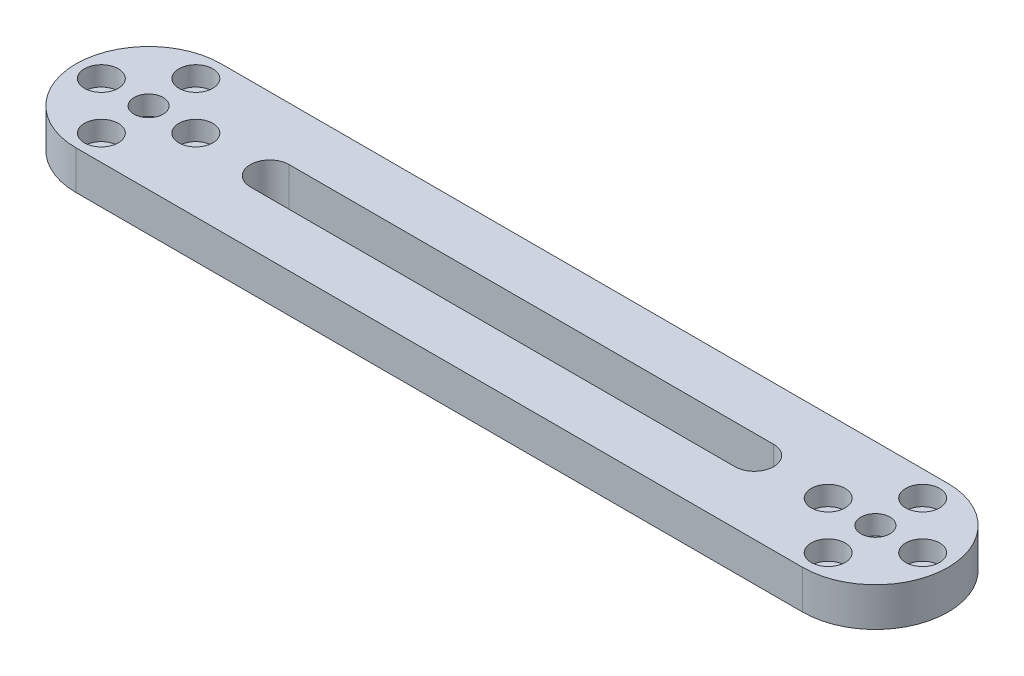
ISO-10303-21;
HEADER;
FILE_DESCRIPTION(('STEP AP214'),'2;1');
FILE_NAME('part.step','',(''),(''),'','','');
FILE_SCHEMA(('AUTOMOTIVE_DESIGN { 1 0 10303 214 1 1 1 1 }'));
ENDSEC;
DATA;
#1=APPLICATION_CONTEXT('core data for automotive mechanical design processes');
#2=APPLICATION_PROTOCOL_DEFINITION('international standard','automotive_design',2000,#1);
#3=PRODUCT_CONTEXT('',#1,'mechanical');
#4=PRODUCT('Part','Part','',(#3));
#5=PRODUCT_RELATED_PRODUCT_CATEGORY('part','',(#4));
#6=PRODUCT_DEFINITION_FORMATION('','',#4);
#7=PRODUCT_DEFINITION_CONTEXT('part definition',#1,'design');
#8=PRODUCT_DEFINITION('design','',#6,#7);
#9=PRODUCT_DEFINITION_SHAPE('','',#8);
#10=(LENGTH_UNIT() NAMED_UNIT(*) SI_UNIT(.MILLI.,.METRE.));
#11=(NAMED_UNIT(*) PLANE_ANGLE_UNIT() SI_UNIT($,.RADIAN.));
#12=(NAMED_UNIT(*) SI_UNIT($,.STERADIAN.) SOLID_ANGLE_UNIT());
#13=UNCERTAINTY_MEASURE_WITH_UNIT(LENGTH_MEASURE(1.E-05),#10,'distance_accuracy_value','');
#14=(GEOMETRIC_REPRESENTATION_CONTEXT(3) GLOBAL_UNCERTAINTY_ASSIGNED_CONTEXT((#13)) GLOBAL_UNIT_ASSIGNED_CONTEXT((#10,
#11,#12)) REPRESENTATION_CONTEXT('',''));
#15=CARTESIAN_POINT('',(0.,0.,0.));
#16=DIRECTION('',(0.,0.,1.));
#17=DIRECTION('',(1.,0.,0.));
#18=AXIS2_PLACEMENT_3D('',#15,#16,#17);
#19=CARTESIAN_POINT('',(0.,8.,0.));
#20=DIRECTION('',(0.,-1.,0.));
#21=DIRECTION('',(0.,0.,-1.));
#22=AXIS2_PLACEMENT_3D('',#19,#20,#21);
#23=CYLINDRICAL_SURFACE('',#22,1.6);
#24=CARTESIAN_POINT('',(0.,0.,0.));
#25=DIRECTION('',(0.,1.,0.));
#26=DIRECTION('',(0.,0.,1.));
#27=AXIS2_PLACEMENT_3D('',#24,#25,#26);
#28=CIRCLE('',#27,1.6);
#29=CARTESIAN_POINT('',(0.,0.,1.6));
#30=VERTEX_POINT('',#29);
#31=EDGE_CURVE('E229',#30,#30,#28,.T.);
#32=ORIENTED_EDGE('',*,*,#31,.F.);
#33=EDGE_LOOP('',(#32));
#34=FACE_BOUND('',#33,.T.);
#35=CARTESIAN_POINT('',(0.,4.,0.));
#36=DIRECTION('',(0.,1.,0.));
#37=DIRECTION('',(0.,0.,1.));
#38=AXIS2_PLACEMENT_3D('',#35,#36,#37);
#39=CIRCLE('',#38,1.6);
#40=CARTESIAN_POINT('',(0.,4.,1.6));
#41=VERTEX_POINT('',#40);
#42=EDGE_CURVE('E281',#41,#41,#39,.T.);
#43=ORIENTED_EDGE('',*,*,#42,.T.);
#44=EDGE_LOOP('',(#43));
#45=FACE_BOUND('',#44,.T.);
#46=ADVANCED_FACE('F41',(#34,#45),#23,.F.);
#47=CARTESIAN_POINT('',(9.71048556079929,8.,0.));
#48=DIRECTION('',(0.,-1.,0.));
#49=DIRECTION('',(0.,0.,-1.));
#50=AXIS2_PLACEMENT_3D('',#47,#48,#49);
#51=CYLINDRICAL_SURFACE('',#50,1.6);
#52=CARTESIAN_POINT('',(9.71048556079929,0.,0.));
#53=DIRECTION('',(0.,1.,0.));
#54=DIRECTION('',(0.,0.,1.));
#55=AXIS2_PLACEMENT_3D('',#52,#53,#54);
#56=CIRCLE('',#55,1.6);
#57=CARTESIAN_POINT('',(9.71048556079929,0.,1.6));
#58=VERTEX_POINT('',#57);
#59=EDGE_CURVE('E223',#58,#58,#56,.T.);
#60=ORIENTED_EDGE('',*,*,#59,.F.);
#61=EDGE_LOOP('',(#60));
#62=FACE_BOUND('',#61,.T.);
#63=CARTESIAN_POINT('',(9.71048556079929,4.,0.));
#64=DIRECTION('',(0.,1.,0.));
#65=DIRECTION('',(0.,0.,1.));
#66=AXIS2_PLACEMENT_3D('',#63,#64,#65);
#67=CIRCLE('',#66,1.6);
#68=CARTESIAN_POINT('',(9.71048556079929,4.,1.6));
#69=VERTEX_POINT('',#68);
#70=EDGE_CURVE('E275',#69,#69,#67,.T.);
#71=ORIENTED_EDGE('',*,*,#70,.T.);
#72=EDGE_LOOP('',(#71));
#73=FACE_BOUND('',#72,.T.);
#74=ADVANCED_FACE('F309',(#62,#73),#51,.F.);
#75=CARTESIAN_POINT('',(-9.75,8.,0.));
#76=DIRECTION('',(0.,-1.,0.));
#77=DIRECTION('',(0.,0.,-1.));
#78=AXIS2_PLACEMENT_3D('',#75,#76,#77);
#79=CYLINDRICAL_SURFACE('',#78,1.6);
#80=CARTESIAN_POINT('',(-9.75,0.,0.));
#81=DIRECTION('',(0.,1.,0.));
#82=DIRECTION('',(0.,0.,1.));
#83=AXIS2_PLACEMENT_3D('',#80,#81,#82);
#84=CIRCLE('',#83,1.6);
#85=CARTESIAN_POINT('',(-9.75,0.,1.6));
#86=VERTEX_POINT('',#85);
#87=EDGE_CURVE('E220',#86,#86,#84,.T.);
#88=ORIENTED_EDGE('',*,*,#87,.F.);
#89=EDGE_LOOP('',(#88));
#90=FACE_BOUND('',#89,.T.);
#91=CARTESIAN_POINT('',(-9.75,4.,0.));
#92=DIRECTION('',(0.,1.,0.));
#93=DIRECTION('',(0.,0.,1.));
#94=AXIS2_PLACEMENT_3D('',#91,#92,#93);
#95=CIRCLE('',#94,1.6);
#96=CARTESIAN_POINT('',(-9.75,4.,1.6));
#97=VERTEX_POINT('',#96);
#98=EDGE_CURVE('E272',#97,#97,#95,.T.);
#99=ORIENTED_EDGE('',*,*,#98,.T.);
#100=EDGE_LOOP('',(#99));
#101=FACE_BOUND('',#100,.T.);
#102=ADVANCED_FACE('F315',(#90,#101),#79,.F.);
#103=CARTESIAN_POINT('',(0.,8.,9.75));
#104=DIRECTION('',(0.,-1.,0.));
#105=DIRECTION('',(0.,0.,-1.));
#106=AXIS2_PLACEMENT_3D('',#103,#104,#105);
#107=CYLINDRICAL_SURFACE('',#106,2.1);
#108=CARTESIAN_POINT('',(0.,0.,9.75));
#109=DIRECTION('',(0.,1.,0.));
#110=DIRECTION('',(0.,0.,1.));
#111=AXIS2_PLACEMENT_3D('',#108,#109,#110);
#112=CIRCLE('',#111,2.1);
#113=CARTESIAN_POINT('',(0.,0.,11.85));
#114=VERTEX_POINT('',#113);
#115=EDGE_CURVE('E217',#114,#114,#112,.T.);
#116=ORIENTED_EDGE('',*,*,#115,.F.);
#117=EDGE_LOOP('',(#116));
#118=FACE_BOUND('',#117,.T.);
#119=CARTESIAN_POINT('',(0.,4.,9.75));
#120=DIRECTION('',(0.,1.,0.));
#121=DIRECTION('',(0.,0.,1.));
#122=AXIS2_PLACEMENT_3D('',#119,#120,#121);
#123=CIRCLE('',#122,2.1);
#124=CARTESIAN_POINT('',(0.,4.,11.85));
#125=VERTEX_POINT('',#124);
#126=EDGE_CURVE('E269',#125,#125,#123,.T.);
#127=ORIENTED_EDGE('',*,*,#126,.T.);
#128=EDGE_LOOP('',(#127));
#129=FACE_BOUND('',#128,.T.);
#130=ADVANCED_FACE('F332',(#118,#129),#107,.F.);
#131=CARTESIAN_POINT('',(0.,8.,-9.75));
#132=DIRECTION('',(0.,-1.,0.));
#133=DIRECTION('',(0.,0.,-1.));
#134=AXIS2_PLACEMENT_3D('',#131,#132,#133);
#135=CYLINDRICAL_SURFACE('',#134,2.1);
#136=CARTESIAN_POINT('',(0.,0.,-9.75));
#137=DIRECTION('',(0.,1.,0.));
#138=DIRECTION('',(0.,0.,1.));
#139=AXIS2_PLACEMENT_3D('',#136,#137,#138);
#140=CIRCLE('',#139,2.1);
#141=CARTESIAN_POINT('',(0.,0.,-7.65));
#142=VERTEX_POINT('',#141);
#143=EDGE_CURVE('E214',#142,#142,#140,.T.);
#144=ORIENTED_EDGE('',*,*,#143,.F.);
#145=EDGE_LOOP('',(#144));
#146=FACE_BOUND('',#145,.T.);
#147=CARTESIAN_POINT('',(0.,4.,-9.75));
#148=DIRECTION('',(0.,1.,0.));
#149=DIRECTION('',(0.,0.,1.));
#150=AXIS2_PLACEMENT_3D('',#147,#148,#149);
#151=CIRCLE('',#150,2.1);
#152=CARTESIAN_POINT('',(0.,4.,-7.65));
#153=VERTEX_POINT('',#152);
#154=EDGE_CURVE('E266',#153,#153,#151,.T.);
#155=ORIENTED_EDGE('',*,*,#154,.T.);
#156=EDGE_LOOP('',(#155));
#157=FACE_BOUND('',#156,.T.);
#158=ADVANCED_FACE('F336',(#146,#157),#135,.F.);
#159=CARTESIAN_POINT('',(0.,8.,15.));
#160=DIRECTION('',(0.,0.,-1.));
#161=DIRECTION('',(-1.,0.,0.));
#162=AXIS2_PLACEMENT_3D('',#159,#160,#161);
#163=PLANE('',#162);
#164=DIRECTION('',(1.,0.,0.));
#165=VECTOR('',#164,1.);
#166=CARTESIAN_POINT('',(0.,0.,15.));
#167=LINE('',#166,#165);
#168=CARTESIAN_POINT('',(0.,0.,15.));
#169=VERTEX_POINT('',#168);
#170=CARTESIAN_POINT('',(150.,0.,15.));
#171=VERTEX_POINT('',#170);
#172=EDGE_CURVE('E232',#169,#171,#167,.T.);
#173=ORIENTED_EDGE('',*,*,#172,.T.);
#174=DIRECTION('',(0.,-1.,0.));
#175=VECTOR('',#174,1.);
#176=CARTESIAN_POINT('',(150.,8.,15.));
#177=LINE('',#176,#175);
#178=CARTESIAN_POINT('',(150.,8.,15.));
#179=VERTEX_POINT('',#178);
#180=EDGE_CURVE('E254',#179,#171,#177,.T.);
#181=ORIENTED_EDGE('',*,*,#180,.F.);
#182=DIRECTION('',(1.,0.,0.));
#183=VECTOR('',#182,1.);
#184=CARTESIAN_POINT('',(0.,8.,15.));
#185=LINE('',#184,#183);
#186=CARTESIAN_POINT('',(0.,8.,15.));
#187=VERTEX_POINT('',#186);
#188=EDGE_CURVE('E195',#187,#179,#185,.T.);
#189=ORIENTED_EDGE('',*,*,#188,.F.);
#190=DIRECTION('',(0.,-1.,0.));
#191=VECTOR('',#190,1.);
#192=CARTESIAN_POINT('',(0.,8.,15.));
#193=LINE('',#192,#191);
#194=EDGE_CURVE('E206',#187,#169,#193,.T.);
#195=ORIENTED_EDGE('',*,*,#194,.T.);
#196=EDGE_LOOP('',(#173,#181,#189,#195));
#197=FACE_BOUND('',#196,.T.);
#198=ADVANCED_FACE('F322',(#197),#163,.F.);
#199=CARTESIAN_POINT('',(150.,8.,0.));
#200=DIRECTION('',(0.,-1.,0.));
#201=DIRECTION('',(0.,0.,-1.));
#202=AXIS2_PLACEMENT_3D('',#199,#200,#201);
#203=CYLINDRICAL_SURFACE('',#202,15.);
#204=CARTESIAN_POINT('',(150.,0.,0.));
#205=DIRECTION('',(0.,1.,0.));
#206=DIRECTION('',(0.,0.,1.));
#207=AXIS2_PLACEMENT_3D('',#204,#205,#206);
#208=CIRCLE('',#207,15.);
#209=CARTESIAN_POINT('',(150.,0.,-15.));
#210=VERTEX_POINT('',#209);
#211=EDGE_CURVE('E235',#171,#210,#208,.T.);
#212=ORIENTED_EDGE('',*,*,#211,.T.);
#213=DIRECTION('',(0.,-1.,0.));
#214=VECTOR('',#213,1.);
#215=CARTESIAN_POINT('',(150.,8.,-15.));
#216=LINE('',#215,#214);
#217=CARTESIAN_POINT('',(150.,8.,-15.));
#218=VERTEX_POINT('',#217);
#219=EDGE_CURVE('E252',#218,#210,#216,.T.);
#220=ORIENTED_EDGE('',*,*,#219,.F.);
#221=CARTESIAN_POINT('',(150.,8.,0.));
#222=DIRECTION('',(0.,1.,0.));
#223=DIRECTION('',(0.,0.,1.));
#224=AXIS2_PLACEMENT_3D('',#221,#222,#223);
#225=CIRCLE('',#224,15.);
#226=EDGE_CURVE('E198',#179,#218,#225,.T.);
#227=ORIENTED_EDGE('',*,*,#226,.F.);
#228=ORIENTED_EDGE('',*,*,#180,.T.);
#229=EDGE_LOOP('',(#212,#220,#227,#228));
#230=FACE_BOUND('',#229,.T.);
#231=ADVANCED_FACE('F390',(#230),#203,.T.);
#232=CARTESIAN_POINT('',(0.,8.,-15.));
#233=DIRECTION('',(0.,0.,-1.));
#234=DIRECTION('',(-1.,0.,0.));
#235=AXIS2_PLACEMENT_3D('',#232,#233,#234);
#236=PLANE('',#235);
#237=DIRECTION('',(1.,0.,0.));
#238=VECTOR('',#237,1.);
#239=CARTESIAN_POINT('',(0.,0.,-15.));
#240=LINE('',#239,#238);
#241=CARTESIAN_POINT('',(0.,0.,-15.));
#242=VERTEX_POINT('',#241);
#243=EDGE_CURVE('E238',#242,#210,#240,.T.);
#244=ORIENTED_EDGE('',*,*,#243,.F.);
#245=DIRECTION('',(0.,-1.,0.));
#246=VECTOR('',#245,1.);
#247=CARTESIAN_POINT('',(0.,8.,-15.));
#248=LINE('',#247,#246);
#249=CARTESIAN_POINT('',(0.,8.,-15.));
#250=VERTEX_POINT('',#249);
#251=EDGE_CURVE('E250',#250,#242,#248,.T.);
#252=ORIENTED_EDGE('',*,*,#251,.F.);
#253=DIRECTION('',(1.,0.,0.));
#254=VECTOR('',#253,1.);
#255=CARTESIAN_POINT('',(0.,8.,-15.));
#256=LINE('',#255,#254);
#257=EDGE_CURVE('E201',#250,#218,#256,.T.);
#258=ORIENTED_EDGE('',*,*,#257,.T.);
#259=ORIENTED_EDGE('',*,*,#219,.T.);
#260=EDGE_LOOP('',(#244,#252,#258,#259));
#261=FACE_BOUND('',#260,.T.);
#262=ADVANCED_FACE('F384',(#261),#236,.T.);
#263=CARTESIAN_POINT('',(159.75,8.,0.));
#264=DIRECTION('',(0.,-1.,0.));
#265=DIRECTION('',(0.,0.,-1.));
#266=AXIS2_PLACEMENT_3D('',#263,#264,#265);
#267=CYLINDRICAL_SURFACE('',#266,1.60000000000002);
#268=CARTESIAN_POINT('',(159.75,4.,0.));
#269=DIRECTION('',(0.,-1.,0.));
#270=DIRECTION('',(0.,0.,-1.));
#271=AXIS2_PLACEMENT_3D('',#268,#269,#270);
#272=CIRCLE('',#271,1.60000000000002);
#273=CARTESIAN_POINT('',(159.75,4.,-1.60000000000002));
#274=VERTEX_POINT('',#273);
#275=EDGE_CURVE('E211',#274,#274,#272,.F.);
#276=ORIENTED_EDGE('',*,*,#275,.T.);
#277=EDGE_LOOP('',(#276));
#278=FACE_BOUND('',#277,.T.);
#279=CARTESIAN_POINT('',(159.75,0.,0.));
#280=DIRECTION('',(0.,1.,0.));
#281=DIRECTION('',(0.,0.,1.));
#282=AXIS2_PLACEMENT_3D('',#279,#280,#281);
#283=CIRCLE('',#282,1.60000000000002);
#284=CARTESIAN_POINT('',(159.75,0.,1.60000000000002));
#285=VERTEX_POINT('',#284);
#286=EDGE_CURVE('E243',#285,#285,#283,.F.);
#287=ORIENTED_EDGE('',*,*,#286,.T.);
#288=EDGE_LOOP('',(#287));
#289=FACE_BOUND('',#288,.T.);
#290=ADVANCED_FACE('F381',(#278,#289),#267,.F.);
#291=CARTESIAN_POINT('',(0.,8.,0.));
#292=DIRECTION('',(0.,-1.,0.));
#293=DIRECTION('',(0.,0.,-1.));
#294=AXIS2_PLACEMENT_3D('',#291,#292,#293);
#295=CYLINDRICAL_SURFACE('',#294,15.);
#296=CARTESIAN_POINT('',(0.,0.,0.));
#297=DIRECTION('',(0.,1.,0.));
#298=DIRECTION('',(0.,0.,1.));
#299=AXIS2_PLACEMENT_3D('',#296,#297,#298);
#300=CIRCLE('',#299,15.);
#301=EDGE_CURVE('E241',#242,#169,#300,.T.);
#302=ORIENTED_EDGE('',*,*,#301,.T.);
#303=ORIENTED_EDGE('',*,*,#194,.F.);
#304=CARTESIAN_POINT('',(0.,8.,0.));
#305=DIRECTION('',(0.,1.,0.));
#306=DIRECTION('',(0.,0.,1.));
#307=AXIS2_PLACEMENT_3D('',#304,#305,#306);
#308=CIRCLE('',#307,15.);
#309=EDGE_CURVE('E204',#250,#187,#308,.T.);
#310=ORIENTED_EDGE('',*,*,#309,.F.);
#311=ORIENTED_EDGE('',*,*,#251,.T.);
#312=EDGE_LOOP('',(#302,#303,#310,#311));
#313=FACE_BOUND('',#312,.T.);
#314=ADVANCED_FACE('F327',(#313),#295,.T.);
#315=CARTESIAN_POINT('',(150.,8.,0.));
#316=DIRECTION('',(0.,-1.,0.));
#317=DIRECTION('',(0.,0.,-1.));
#318=AXIS2_PLACEMENT_3D('',#315,#316,#317);
#319=CYLINDRICAL_SURFACE('',#318,1.60000000000002);
#320=CARTESIAN_POINT('',(150.,4.,0.));
#321=DIRECTION('',(0.,-1.,0.));
#322=DIRECTION('',(0.,0.,-1.));
#323=AXIS2_PLACEMENT_3D('',#320,#321,#322);
#324=CIRCLE('',#323,1.60000000000002);
#325=CARTESIAN_POINT('',(150.,4.,-1.60000000000002));
#326=VERTEX_POINT('',#325);
#327=EDGE_CURVE('E278',#326,#326,#324,.T.);
#328=ORIENTED_EDGE('',*,*,#327,.F.);
#329=EDGE_LOOP('',(#328));
#330=FACE_BOUND('',#329,.T.);
#331=CARTESIAN_POINT('',(150.,0.,0.));
#332=DIRECTION('',(0.,1.,0.));
#333=DIRECTION('',(0.,0.,1.));
#334=AXIS2_PLACEMENT_3D('',#331,#332,#333);
#335=CIRCLE('',#334,1.60000000000002);
#336=CARTESIAN_POINT('',(150.,0.,1.60000000000002));
#337=VERTEX_POINT('',#336);
#338=EDGE_CURVE('E226',#337,#337,#335,.T.);
#339=ORIENTED_EDGE('',*,*,#338,.F.);
#340=EDGE_LOOP('',(#339));
#341=FACE_BOUND('',#340,.T.);
#342=ADVANCED_FACE('F324',(#330,#341),#319,.F.);
#343=CARTESIAN_POINT('',(150.,8.,-9.75));
#344=DIRECTION('',(0.,-1.,0.));
#345=DIRECTION('',(0.,0.,-1.));
#346=AXIS2_PLACEMENT_3D('',#343,#344,#345);
#347=CYLINDRICAL_SURFACE('',#346,2.09999999999999);
#348=CARTESIAN_POINT('',(150.,4.,-9.75));
#349=DIRECTION('',(0.,-1.,0.));
#350=DIRECTION('',(0.,0.,-1.));
#351=AXIS2_PLACEMENT_3D('',#348,#349,#350);
#352=CIRCLE('',#351,2.09999999999999);
#353=CARTESIAN_POINT('',(150.,4.,-11.85));
#354=VERTEX_POINT('',#353);
#355=EDGE_CURVE('E263',#354,#354,#352,.F.);
#356=ORIENTED_EDGE('',*,*,#355,.T.);
#357=EDGE_LOOP('',(#356));
#358=FACE_BOUND('',#357,.T.);
#359=CARTESIAN_POINT('',(150.,0.,-9.75));
#360=DIRECTION('',(0.,1.,0.));
#361=DIRECTION('',(0.,0.,1.));
#362=AXIS2_PLACEMENT_3D('',#359,#360,#361);
#363=CIRCLE('',#362,2.09999999999999);
#364=CARTESIAN_POINT('',(150.,0.,-7.65000000000001));
#365=VERTEX_POINT('',#364);
#366=EDGE_CURVE('E210',#365,#365,#363,.F.);
#367=ORIENTED_EDGE('',*,*,#366,.T.);
#368=EDGE_LOOP('',(#367));
#369=FACE_BOUND('',#368,.T.);
#370=ADVANCED_FACE('F326',(#358,#369),#347,.F.);
#371=CARTESIAN_POINT('',(150.,8.,9.75));
#372=DIRECTION('',(0.,-1.,0.));
#373=DIRECTION('',(0.,0.,-1.));
#374=AXIS2_PLACEMENT_3D('',#371,#372,#373);
#375=CYLINDRICAL_SURFACE('',#374,2.09999999999999);
#376=CARTESIAN_POINT('',(150.,4.,9.75));
#377=DIRECTION('',(0.,-1.,0.));
#378=DIRECTION('',(0.,0.,-1.));
#379=AXIS2_PLACEMENT_3D('',#376,#377,#378);
#380=CIRCLE('',#379,2.09999999999999);
#381=CARTESIAN_POINT('',(150.,4.,7.65000000000001));
#382=VERTEX_POINT('',#381);
#383=EDGE_CURVE('E260',#382,#382,#380,.F.);
#384=ORIENTED_EDGE('',*,*,#383,.T.);
#385=EDGE_LOOP('',(#384));
#386=FACE_BOUND('',#385,.T.);
#387=CARTESIAN_POINT('',(150.,0.,9.75));
#388=DIRECTION('',(0.,1.,0.));
#389=DIRECTION('',(0.,0.,1.));
#390=AXIS2_PLACEMENT_3D('',#387,#388,#389);
#391=CIRCLE('',#390,2.09999999999999);
#392=CARTESIAN_POINT('',(150.,0.,11.85));
#393=VERTEX_POINT('',#392);
#394=EDGE_CURVE('E207',#393,#393,#391,.F.);
#395=ORIENTED_EDGE('',*,*,#394,.T.);
#396=EDGE_LOOP('',(#395));
#397=FACE_BOUND('',#396,.T.);
#398=ADVANCED_FACE('F43',(#386,#397),#375,.F.);
#399=CARTESIAN_POINT('',(140.289514439201,8.,0.));
#400=DIRECTION('',(0.,-1.,0.));
#401=DIRECTION('',(0.,0.,-1.));
#402=AXIS2_PLACEMENT_3D('',#399,#400,#401);
#403=CYLINDRICAL_SURFACE('',#402,1.59999999999999);
#404=CARTESIAN_POINT('',(140.289514439201,4.,0.));
#405=DIRECTION('',(0.,-1.,0.));
#406=DIRECTION('',(0.,0.,-1.));
#407=AXIS2_PLACEMENT_3D('',#404,#405,#406);
#408=CIRCLE('',#407,1.59999999999999);
#409=CARTESIAN_POINT('',(140.289514439201,4.,-1.59999999999999));
#410=VERTEX_POINT('',#409);
#411=EDGE_CURVE('E192',#410,#410,#408,.F.);
#412=ORIENTED_EDGE('',*,*,#411,.T.);
#413=EDGE_LOOP('',(#412));
#414=FACE_BOUND('',#413,.T.);
#415=CARTESIAN_POINT('',(140.289514439201,0.,0.));
#416=DIRECTION('',(0.,1.,0.));
#417=DIRECTION('',(0.,0.,1.));
#418=AXIS2_PLACEMENT_3D('',#415,#416,#417);
#419=CIRCLE('',#418,1.59999999999999);
#420=CARTESIAN_POINT('',(140.289514439201,0.,1.59999999999999));
#421=VERTEX_POINT('',#420);
#422=EDGE_CURVE('E199',#421,#421,#419,.F.);
#423=ORIENTED_EDGE('',*,*,#422,.T.);
#424=EDGE_LOOP('',(#423));
#425=FACE_BOUND('',#424,.T.);
#426=ADVANCED_FACE('F345',(#414,#425),#403,.F.);
#427=CARTESIAN_POINT('',(0.,8.,0.));
#428=DIRECTION('',(0.,1.,0.));
#429=DIRECTION('',(0.,0.,1.));
#430=AXIS2_PLACEMENT_3D('',#427,#428,#429);
#431=PLANE('',#430);
#432=CARTESIAN_POINT('',(25.,8.,0.));
#433=DIRECTION('',(0.,1.,0.));
#434=DIRECTION('',(0.,0.,1.));
#435=AXIS2_PLACEMENT_3D('',#432,#433,#434);
#436=CIRCLE('',#435,4.);
#437=CARTESIAN_POINT('',(25.,8.,-4.));
#438=VERTEX_POINT('',#437);
#439=CARTESIAN_POINT('',(25.,8.,4.));
#440=VERTEX_POINT('',#439);
#441=EDGE_CURVE('E56',#438,#440,#436,.T.);
#442=ORIENTED_EDGE('',*,*,#441,.F.);
#443=DIRECTION('',(-1.,0.,0.));
#444=VECTOR('',#443,1.);
#445=CARTESIAN_POINT('',(25.,8.,-4.));
#446=LINE('',#445,#444);
#447=CARTESIAN_POINT('',(125.,8.,-4.));
#448=VERTEX_POINT('',#447);
#449=EDGE_CURVE('E125',#448,#438,#446,.T.);
#450=ORIENTED_EDGE('',*,*,#449,.F.);
#451=CARTESIAN_POINT('',(125.,8.,0.));
#452=DIRECTION('',(0.,1.,0.));
#453=DIRECTION('',(0.,0.,1.));
#454=AXIS2_PLACEMENT_3D('',#451,#452,#453);
#455=CIRCLE('',#454,4.);
#456=CARTESIAN_POINT('',(125.,8.,4.));
#457=VERTEX_POINT('',#456);
#458=EDGE_CURVE('E109',#457,#448,#455,.T.);
#459=ORIENTED_EDGE('',*,*,#458,.F.);
#460=DIRECTION('',(1.,0.,0.));
#461=VECTOR('',#460,1.);
#462=CARTESIAN_POINT('',(25.,8.,4.));
#463=LINE('',#462,#461);
#464=EDGE_CURVE('E118',#440,#457,#463,.T.);
#465=ORIENTED_EDGE('',*,*,#464,.F.);
#466=EDGE_LOOP('',(#442,#450,#459,#465));
#467=FACE_BOUND('',#466,.T.);
#468=CARTESIAN_POINT('',(-9.74999999999997,8.,0.));
#469=DIRECTION('',(0.,1.,0.));
#470=DIRECTION('',(0.,0.,1.));
#471=AXIS2_PLACEMENT_3D('',#468,#469,#470);
#472=CIRCLE('',#471,3.5);
#473=CARTESIAN_POINT('',(-9.74999999999997,8.,3.5));
#474=VERTEX_POINT('',#473);
#475=EDGE_CURVE('E148',#474,#474,#472,.T.);
#476=ORIENTED_EDGE('',*,*,#475,.F.);
#477=EDGE_LOOP('',(#476));
#478=FACE_BOUND('',#477,.T.);
#479=CARTESIAN_POINT('',(0.,8.,9.74999999999998));
#480=DIRECTION('',(0.,1.,0.));
#481=DIRECTION('',(0.,0.,1.));
#482=AXIS2_PLACEMENT_3D('',#479,#480,#481);
#483=CIRCLE('',#482,3.5);
#484=CARTESIAN_POINT('',(0.,8.,13.25));
#485=VERTEX_POINT('',#484);
#486=EDGE_CURVE('E141',#485,#485,#483,.T.);
#487=ORIENTED_EDGE('',*,*,#486,.F.);
#488=EDGE_LOOP('',(#487));
#489=FACE_BOUND('',#488,.T.);
#490=CARTESIAN_POINT('',(9.74999999999997,8.,0.));
#491=DIRECTION('',(0.,1.,0.));
#492=DIRECTION('',(0.,0.,1.));
#493=AXIS2_PLACEMENT_3D('',#490,#491,#492);
#494=CIRCLE('',#493,3.5);
#495=CARTESIAN_POINT('',(9.74999999999997,8.,3.5));
#496=VERTEX_POINT('',#495);
#497=EDGE_CURVE('E162',#496,#496,#494,.T.);
#498=ORIENTED_EDGE('',*,*,#497,.F.);
#499=EDGE_LOOP('',(#498));
#500=FACE_BOUND('',#499,.T.);
#501=CARTESIAN_POINT('',(0.,8.,-9.74999999999997));
#502=DIRECTION('',(0.,1.,0.));
#503=DIRECTION('',(0.,0.,1.));
#504=AXIS2_PLACEMENT_3D('',#501,#502,#503);
#505=CIRCLE('',#504,3.5);
#506=CARTESIAN_POINT('',(0.,8.,-6.24999999999997));
#507=VERTEX_POINT('',#506);
#508=EDGE_CURVE('E155',#507,#507,#505,.T.);
#509=ORIENTED_EDGE('',*,*,#508,.F.);
#510=EDGE_LOOP('',(#509));
#511=FACE_BOUND('',#510,.T.);
#512=CARTESIAN_POINT('',(150.,8.,-9.74999999999997));
#513=DIRECTION('',(0.,1.,0.));
#514=DIRECTION('',(0.,0.,-1.));
#515=AXIS2_PLACEMENT_3D('',#512,#513,#514);
#516=CIRCLE('',#515,3.49999999999999);
#517=CARTESIAN_POINT('',(150.,8.,-13.25));
#518=VERTEX_POINT('',#517);
#519=EDGE_CURVE('E174',#518,#518,#516,.T.);
#520=ORIENTED_EDGE('',*,*,#519,.F.);
#521=EDGE_LOOP('',(#520));
#522=FACE_BOUND('',#521,.T.);
#523=CARTESIAN_POINT('',(140.25,8.,0.));
#524=DIRECTION('',(0.,1.,0.));
#525=DIRECTION('',(0.,0.,-1.));
#526=AXIS2_PLACEMENT_3D('',#523,#524,#525);
#527=CIRCLE('',#526,3.49999999999999);
#528=CARTESIAN_POINT('',(140.25,8.,-3.49999999999999));
#529=VERTEX_POINT('',#528);
#530=EDGE_CURVE('E167',#529,#529,#527,.T.);
#531=ORIENTED_EDGE('',*,*,#530,.F.);
#532=EDGE_LOOP('',(#531));
#533=FACE_BOUND('',#532,.T.);
#534=CARTESIAN_POINT('',(150.,8.,9.74999999999998));
#535=DIRECTION('',(0.,1.,0.));
#536=DIRECTION('',(0.,0.,-1.));
#537=AXIS2_PLACEMENT_3D('',#534,#535,#536);
#538=CIRCLE('',#537,3.49999999999999);
#539=CARTESIAN_POINT('',(150.,8.,6.24999999999998));
#540=VERTEX_POINT('',#539);
#541=EDGE_CURVE('E184',#540,#540,#538,.T.);
#542=ORIENTED_EDGE('',*,*,#541,.F.);
#543=EDGE_LOOP('',(#542));
#544=FACE_BOUND('',#543,.T.);
#545=CARTESIAN_POINT('',(159.75,8.,0.));
#546=DIRECTION('',(0.,1.,0.));
#547=DIRECTION('',(0.,0.,-1.));
#548=AXIS2_PLACEMENT_3D('',#545,#546,#547);
#549=CIRCLE('',#548,3.49999999999999);
#550=CARTESIAN_POINT('',(159.75,8.,-3.49999999999999));
#551=VERTEX_POINT('',#550);
#552=EDGE_CURVE('E154',#551,#551,#549,.T.);
#553=ORIENTED_EDGE('',*,*,#552,.F.);
#554=EDGE_LOOP('',(#553));
#555=FACE_BOUND('',#554,.T.);
#556=CARTESIAN_POINT('',(150.,8.,0.));
#557=DIRECTION('',(0.,1.,0.));
#558=DIRECTION('',(0.,0.,-1.));
#559=AXIS2_PLACEMENT_3D('',#556,#557,#558);
#560=CIRCLE('',#559,2.99999999999999);
#561=CARTESIAN_POINT('',(150.,8.,-3.00000000000001));
#562=VERTEX_POINT('',#561);
#563=EDGE_CURVE('E135',#562,#562,#560,.T.);
#564=ORIENTED_EDGE('',*,*,#563,.F.);
#565=EDGE_LOOP('',(#564));
#566=FACE_BOUND('',#565,.T.);
#567=CARTESIAN_POINT('',(0.,8.,0.));
#568=DIRECTION('',(0.,1.,0.));
#569=DIRECTION('',(0.,0.,1.));
#570=AXIS2_PLACEMENT_3D('',#567,#568,#569);
#571=CIRCLE('',#570,3.);
#572=CARTESIAN_POINT('',(0.,8.,3.));
#573=VERTEX_POINT('',#572);
#574=EDGE_CURVE('E158',#573,#573,#571,.T.);
#575=ORIENTED_EDGE('',*,*,#574,.F.);
#576=EDGE_LOOP('',(#575));
#577=FACE_BOUND('',#576,.T.);
#578=ORIENTED_EDGE('',*,*,#188,.T.);
#579=ORIENTED_EDGE('',*,*,#226,.T.);
#580=ORIENTED_EDGE('',*,*,#257,.F.);
#581=ORIENTED_EDGE('',*,*,#309,.T.);
#582=EDGE_LOOP('',(#578,#579,#580,#581));
#583=FACE_BOUND('',#582,.T.);
#584=ADVANCED_FACE('F122',(#467,#478,#489,#500,#511,#522,#533,#544,#555,#566,#577,#583),#431,.T.);
#585=CARTESIAN_POINT('',(0.,0.,0.));
#586=DIRECTION('',(0.,1.,0.));
#587=DIRECTION('',(0.,0.,1.));
#588=AXIS2_PLACEMENT_3D('',#585,#586,#587);
#589=PLANE('',#588);
#590=DIRECTION('',(-1.,0.,0.));
#591=VECTOR('',#590,1.);
#592=CARTESIAN_POINT('',(0.,0.,-4.));
#593=LINE('',#592,#591);
#594=CARTESIAN_POINT('',(125.,0.,-4.));
#595=VERTEX_POINT('',#594);
#596=CARTESIAN_POINT('',(25.,0.,-4.));
#597=VERTEX_POINT('',#596);
#598=EDGE_CURVE('E49',#595,#597,#593,.T.);
#599=ORIENTED_EDGE('',*,*,#598,.T.);
#600=CARTESIAN_POINT('',(25.,0.,0.));
#601=DIRECTION('',(0.,1.,0.));
#602=DIRECTION('',(0.,0.,1.));
#603=AXIS2_PLACEMENT_3D('',#600,#601,#602);
#604=CIRCLE('',#603,4.);
#605=CARTESIAN_POINT('',(25.,0.,4.));
#606=VERTEX_POINT('',#605);
#607=EDGE_CURVE('E11',#597,#606,#604,.T.);
#608=ORIENTED_EDGE('',*,*,#607,.T.);
#609=DIRECTION('',(1.,0.,0.));
#610=VECTOR('',#609,1.);
#611=CARTESIAN_POINT('',(0.,0.,4.));
#612=LINE('',#611,#610);
#613=CARTESIAN_POINT('',(125.,0.,4.));
#614=VERTEX_POINT('',#613);
#615=EDGE_CURVE('E257',#606,#614,#612,.T.);
#616=ORIENTED_EDGE('',*,*,#615,.T.);
#617=CARTESIAN_POINT('',(125.,0.,0.));
#618=DIRECTION('',(0.,1.,0.));
#619=DIRECTION('',(0.,0.,1.));
#620=AXIS2_PLACEMENT_3D('',#617,#618,#619);
#621=CIRCLE('',#620,4.);
#622=EDGE_CURVE('E112',#614,#595,#621,.T.);
#623=ORIENTED_EDGE('',*,*,#622,.T.);
#624=EDGE_LOOP('',(#599,#608,#616,#623));
#625=FACE_BOUND('',#624,.T.);
#626=ORIENTED_EDGE('',*,*,#394,.F.);
#627=EDGE_LOOP('',(#626));
#628=FACE_BOUND('',#627,.T.);
#629=ORIENTED_EDGE('',*,*,#366,.F.);
#630=EDGE_LOOP('',(#629));
#631=FACE_BOUND('',#630,.T.);
#632=ORIENTED_EDGE('',*,*,#143,.T.);
#633=EDGE_LOOP('',(#632));
#634=FACE_BOUND('',#633,.T.);
#635=ORIENTED_EDGE('',*,*,#115,.T.);
#636=EDGE_LOOP('',(#635));
#637=FACE_BOUND('',#636,.T.);
#638=ORIENTED_EDGE('',*,*,#87,.T.);
#639=EDGE_LOOP('',(#638));
#640=FACE_BOUND('',#639,.T.);
#641=ORIENTED_EDGE('',*,*,#59,.T.);
#642=EDGE_LOOP('',(#641));
#643=FACE_BOUND('',#642,.T.);
#644=ORIENTED_EDGE('',*,*,#338,.T.);
#645=EDGE_LOOP('',(#644));
#646=FACE_BOUND('',#645,.T.);
#647=ORIENTED_EDGE('',*,*,#31,.T.);
#648=EDGE_LOOP('',(#647));
#649=FACE_BOUND('',#648,.T.);
#650=ORIENTED_EDGE('',*,*,#172,.F.);
#651=ORIENTED_EDGE('',*,*,#301,.F.);
#652=ORIENTED_EDGE('',*,*,#243,.T.);
#653=ORIENTED_EDGE('',*,*,#211,.F.);
#654=EDGE_LOOP('',(#650,#651,#652,#653));
#655=FACE_BOUND('',#654,.T.);
#656=ORIENTED_EDGE('',*,*,#286,.F.);
#657=EDGE_LOOP('',(#656));
#658=FACE_BOUND('',#657,.T.);
#659=ORIENTED_EDGE('',*,*,#422,.F.);
#660=EDGE_LOOP('',(#659));
#661=FACE_BOUND('',#660,.T.);
#662=ADVANCED_FACE('F289',(#625,#628,#631,#634,#637,#640,#643,#646,#649,#655,#658,#661),#589,.F.);
#663=CARTESIAN_POINT('',(0.,4.,0.));
#664=DIRECTION('',(0.,1.,0.));
#665=DIRECTION('',(0.,0.,1.));
#666=AXIS2_PLACEMENT_3D('',#663,#664,#665);
#667=CYLINDRICAL_SURFACE('',#666,3.);
#668=CARTESIAN_POINT('',(0.,4.,0.));
#669=DIRECTION('',(0.,1.,0.));
#670=DIRECTION('',(0.,0.,1.));
#671=AXIS2_PLACEMENT_3D('',#668,#669,#670);
#672=CIRCLE('',#671,3.);
#673=CARTESIAN_POINT('',(0.,4.,3.));
#674=VERTEX_POINT('',#673);
#675=EDGE_CURVE('E189',#674,#674,#672,.T.);
#676=ORIENTED_EDGE('',*,*,#675,.F.);
#677=EDGE_LOOP('',(#676));
#678=FACE_BOUND('',#677,.T.);
#679=ORIENTED_EDGE('',*,*,#574,.T.);
#680=EDGE_LOOP('',(#679));
#681=FACE_BOUND('',#680,.T.);
#682=ADVANCED_FACE('F353',(#678,#681),#667,.F.);
#683=CARTESIAN_POINT('',(0.,4.,0.));
#684=DIRECTION('',(0.,1.,0.));
#685=DIRECTION('',(0.,0.,1.));
#686=AXIS2_PLACEMENT_3D('',#683,#684,#685);
#687=PLANE('',#686);
#688=ORIENTED_EDGE('',*,*,#42,.F.);
#689=EDGE_LOOP('',(#688));
#690=FACE_BOUND('',#689,.T.);
#691=ORIENTED_EDGE('',*,*,#675,.T.);
#692=EDGE_LOOP('',(#691));
#693=FACE_BOUND('',#692,.T.);
#694=ADVANCED_FACE('F521',(#690,#693),#687,.T.);
#695=CARTESIAN_POINT('',(150.,4.,0.));
#696=DIRECTION('',(0.,1.,0.));
#697=DIRECTION('',(0.,0.,1.));
#698=AXIS2_PLACEMENT_3D('',#695,#696,#697);
#699=CYLINDRICAL_SURFACE('',#698,2.99999999999999);
#700=CARTESIAN_POINT('',(150.,4.,0.));
#701=DIRECTION('',(0.,1.,0.));
#702=DIRECTION('',(0.,0.,-1.));
#703=AXIS2_PLACEMENT_3D('',#700,#701,#702);
#704=CIRCLE('',#703,2.99999999999999);
#705=CARTESIAN_POINT('',(150.,4.,-3.00000000000001));
#706=VERTEX_POINT('',#705);
#707=EDGE_CURVE('E132',#706,#706,#704,.T.);
#708=ORIENTED_EDGE('',*,*,#707,.F.);
#709=EDGE_LOOP('',(#708));
#710=FACE_BOUND('',#709,.T.);
#711=ORIENTED_EDGE('',*,*,#563,.T.);
#712=EDGE_LOOP('',(#711));
#713=FACE_BOUND('',#712,.T.);
#714=ADVANCED_FACE('F532',(#710,#713),#699,.F.);
#715=CARTESIAN_POINT('',(150.,4.,0.));
#716=DIRECTION('',(0.,-1.,0.));
#717=DIRECTION('',(0.,0.,-1.));
#718=AXIS2_PLACEMENT_3D('',#715,#716,#717);
#719=PLANE('',#718);
#720=ORIENTED_EDGE('',*,*,#327,.T.);
#721=EDGE_LOOP('',(#720));
#722=FACE_BOUND('',#721,.T.);
#723=ORIENTED_EDGE('',*,*,#707,.T.);
#724=EDGE_LOOP('',(#723));
#725=FACE_BOUND('',#724,.T.);
#726=ADVANCED_FACE('F543',(#722,#725),#719,.F.);
#727=CARTESIAN_POINT('',(159.75,4.,0.));
#728=DIRECTION('',(0.,-1.,0.));
#729=DIRECTION('',(0.,0.,-1.));
#730=AXIS2_PLACEMENT_3D('',#727,#728,#729);
#731=PLANE('',#730);
#732=CARTESIAN_POINT('',(159.75,4.,0.));
#733=DIRECTION('',(0.,1.,0.));
#734=DIRECTION('',(0.,0.,-1.));
#735=AXIS2_PLACEMENT_3D('',#732,#733,#734);
#736=CIRCLE('',#735,3.49999999999999);
#737=CARTESIAN_POINT('',(159.75,4.,-3.49999999999999));
#738=VERTEX_POINT('',#737);
#739=EDGE_CURVE('E181',#738,#738,#736,.T.);
#740=ORIENTED_EDGE('',*,*,#739,.T.);
#741=EDGE_LOOP('',(#740));
#742=FACE_BOUND('',#741,.T.);
#743=ORIENTED_EDGE('',*,*,#275,.F.);
#744=EDGE_LOOP('',(#743));
#745=FACE_BOUND('',#744,.T.);
#746=ADVANCED_FACE('F553',(#742,#745),#731,.F.);
#747=CARTESIAN_POINT('',(159.75,4.,0.));
#748=DIRECTION('',(0.,1.,0.));
#749=DIRECTION('',(0.,0.,1.));
#750=AXIS2_PLACEMENT_3D('',#747,#748,#749);
#751=CYLINDRICAL_SURFACE('',#750,3.49999999999999);
#752=ORIENTED_EDGE('',*,*,#739,.F.);
#753=EDGE_LOOP('',(#752));
#754=FACE_BOUND('',#753,.T.);
#755=ORIENTED_EDGE('',*,*,#552,.T.);
#756=EDGE_LOOP('',(#755));
#757=FACE_BOUND('',#756,.T.);
#758=ADVANCED_FACE('F564',(#754,#757),#751,.F.);
#759=CARTESIAN_POINT('',(150.,4.,9.74999999999998));
#760=DIRECTION('',(0.,-1.,0.));
#761=DIRECTION('',(0.,0.,-1.));
#762=AXIS2_PLACEMENT_3D('',#759,#760,#761);
#763=PLANE('',#762);
#764=CARTESIAN_POINT('',(150.,4.,9.74999999999998));
#765=DIRECTION('',(0.,1.,0.));
#766=DIRECTION('',(0.,0.,-1.));
#767=AXIS2_PLACEMENT_3D('',#764,#765,#766);
#768=CIRCLE('',#767,3.49999999999999);
#769=CARTESIAN_POINT('',(150.,4.,6.24999999999998));
#770=VERTEX_POINT('',#769);
#771=EDGE_CURVE('E170',#770,#770,#768,.T.);
#772=ORIENTED_EDGE('',*,*,#771,.T.);
#773=EDGE_LOOP('',(#772));
#774=FACE_BOUND('',#773,.T.);
#775=ORIENTED_EDGE('',*,*,#383,.F.);
#776=EDGE_LOOP('',(#775));
#777=FACE_BOUND('',#776,.T.);
#778=ADVANCED_FACE('F575',(#774,#777),#763,.F.);
#779=CARTESIAN_POINT('',(150.,4.,9.74999999999998));
#780=DIRECTION('',(0.,1.,0.));
#781=DIRECTION('',(0.,0.,1.));
#782=AXIS2_PLACEMENT_3D('',#779,#780,#781);
#783=CYLINDRICAL_SURFACE('',#782,3.49999999999999);
#784=ORIENTED_EDGE('',*,*,#771,.F.);
#785=EDGE_LOOP('',(#784));
#786=FACE_BOUND('',#785,.T.);
#787=ORIENTED_EDGE('',*,*,#541,.T.);
#788=EDGE_LOOP('',(#787));
#789=FACE_BOUND('',#788,.T.);
#790=ADVANCED_FACE('F586',(#786,#789),#783,.F.);
#791=CARTESIAN_POINT('',(140.25,4.,0.));
#792=DIRECTION('',(0.,-1.,0.));
#793=DIRECTION('',(0.,0.,-1.));
#794=AXIS2_PLACEMENT_3D('',#791,#792,#793);
#795=PLANE('',#794);
#796=CARTESIAN_POINT('',(140.25,4.,0.));
#797=DIRECTION('',(0.,1.,0.));
#798=DIRECTION('',(0.,0.,-1.));
#799=AXIS2_PLACEMENT_3D('',#796,#797,#798);
#800=CIRCLE('',#799,3.49999999999999);
#801=CARTESIAN_POINT('',(140.25,4.,-3.49999999999999));
#802=VERTEX_POINT('',#801);
#803=EDGE_CURVE('E171',#802,#802,#800,.T.);
#804=ORIENTED_EDGE('',*,*,#803,.T.);
#805=EDGE_LOOP('',(#804));
#806=FACE_BOUND('',#805,.T.);
#807=ORIENTED_EDGE('',*,*,#411,.F.);
#808=EDGE_LOOP('',(#807));
#809=FACE_BOUND('',#808,.T.);
#810=ADVANCED_FACE('F597',(#806,#809),#795,.F.);
#811=CARTESIAN_POINT('',(140.25,4.,0.));
#812=DIRECTION('',(0.,1.,0.));
#813=DIRECTION('',(0.,0.,1.));
#814=AXIS2_PLACEMENT_3D('',#811,#812,#813);
#815=CYLINDRICAL_SURFACE('',#814,3.49999999999999);
#816=ORIENTED_EDGE('',*,*,#803,.F.);
#817=EDGE_LOOP('',(#816));
#818=FACE_BOUND('',#817,.T.);
#819=ORIENTED_EDGE('',*,*,#530,.T.);
#820=EDGE_LOOP('',(#819));
#821=FACE_BOUND('',#820,.T.);
#822=ADVANCED_FACE('F608',(#818,#821),#815,.F.);
#823=CARTESIAN_POINT('',(150.,4.,-9.74999999999997));
#824=DIRECTION('',(0.,-1.,0.));
#825=DIRECTION('',(0.,0.,-1.));
#826=AXIS2_PLACEMENT_3D('',#823,#824,#825);
#827=PLANE('',#826);
#828=CARTESIAN_POINT('',(150.,4.,-9.74999999999997));
#829=DIRECTION('',(0.,1.,0.));
#830=DIRECTION('',(0.,0.,-1.));
#831=AXIS2_PLACEMENT_3D('',#828,#829,#830);
#832=CIRCLE('',#831,3.49999999999999);
#833=CARTESIAN_POINT('',(150.,4.,-13.25));
#834=VERTEX_POINT('',#833);
#835=EDGE_CURVE('E138',#834,#834,#832,.T.);
#836=ORIENTED_EDGE('',*,*,#835,.T.);
#837=EDGE_LOOP('',(#836));
#838=FACE_BOUND('',#837,.T.);
#839=ORIENTED_EDGE('',*,*,#355,.F.);
#840=EDGE_LOOP('',(#839));
#841=FACE_BOUND('',#840,.T.);
#842=ADVANCED_FACE('F619',(#838,#841),#827,.F.);
#843=CARTESIAN_POINT('',(150.,4.,-9.74999999999997));
#844=DIRECTION('',(0.,1.,0.));
#845=DIRECTION('',(0.,0.,1.));
#846=AXIS2_PLACEMENT_3D('',#843,#844,#845);
#847=CYLINDRICAL_SURFACE('',#846,3.49999999999999);
#848=ORIENTED_EDGE('',*,*,#835,.F.);
#849=EDGE_LOOP('',(#848));
#850=FACE_BOUND('',#849,.T.);
#851=ORIENTED_EDGE('',*,*,#519,.T.);
#852=EDGE_LOOP('',(#851));
#853=FACE_BOUND('',#852,.T.);
#854=ADVANCED_FACE('F630',(#850,#853),#847,.F.);
#855=CARTESIAN_POINT('',(0.,4.,-9.74999999999997));
#856=DIRECTION('',(0.,1.,0.));
#857=DIRECTION('',(0.,0.,1.));
#858=AXIS2_PLACEMENT_3D('',#855,#856,#857);
#859=CYLINDRICAL_SURFACE('',#858,3.5);
#860=CARTESIAN_POINT('',(0.,4.,-9.74999999999997));
#861=DIRECTION('',(0.,1.,0.));
#862=DIRECTION('',(0.,0.,1.));
#863=AXIS2_PLACEMENT_3D('',#860,#861,#862);
#864=CIRCLE('',#863,3.5);
#865=CARTESIAN_POINT('',(0.,4.,-6.24999999999997));
#866=VERTEX_POINT('',#865);
#867=EDGE_CURVE('E159',#866,#866,#864,.T.);
#868=ORIENTED_EDGE('',*,*,#867,.F.);
#869=EDGE_LOOP('',(#868));
#870=FACE_BOUND('',#869,.T.);
#871=ORIENTED_EDGE('',*,*,#508,.T.);
#872=EDGE_LOOP('',(#871));
#873=FACE_BOUND('',#872,.T.);
#874=ADVANCED_FACE('F641',(#870,#873),#859,.F.);
#875=CARTESIAN_POINT('',(0.,4.,-9.74999999999997));
#876=DIRECTION('',(0.,1.,0.));
#877=DIRECTION('',(0.,0.,1.));
#878=AXIS2_PLACEMENT_3D('',#875,#876,#877);
#879=PLANE('',#878);
#880=ORIENTED_EDGE('',*,*,#154,.F.);
#881=EDGE_LOOP('',(#880));
#882=FACE_BOUND('',#881,.T.);
#883=ORIENTED_EDGE('',*,*,#867,.T.);
#884=EDGE_LOOP('',(#883));
#885=FACE_BOUND('',#884,.T.);
#886=ADVANCED_FACE('F652',(#882,#885),#879,.T.);
#887=CARTESIAN_POINT('',(9.74999999999997,4.,0.));
#888=DIRECTION('',(0.,1.,0.));
#889=DIRECTION('',(0.,0.,1.));
#890=AXIS2_PLACEMENT_3D('',#887,#888,#889);
#891=CYLINDRICAL_SURFACE('',#890,3.5);
#892=CARTESIAN_POINT('',(9.74999999999997,4.,0.));
#893=DIRECTION('',(0.,1.,0.));
#894=DIRECTION('',(0.,0.,1.));
#895=AXIS2_PLACEMENT_3D('',#892,#893,#894);
#896=CIRCLE('',#895,3.5);
#897=CARTESIAN_POINT('',(9.74999999999997,4.,3.5));
#898=VERTEX_POINT('',#897);
#899=EDGE_CURVE('E144',#898,#898,#896,.T.);
#900=ORIENTED_EDGE('',*,*,#899,.F.);
#901=EDGE_LOOP('',(#900));
#902=FACE_BOUND('',#901,.T.);
#903=ORIENTED_EDGE('',*,*,#497,.T.);
#904=EDGE_LOOP('',(#903));
#905=FACE_BOUND('',#904,.T.);
#906=ADVANCED_FACE('F663',(#902,#905),#891,.F.);
#907=CARTESIAN_POINT('',(9.74999999999997,4.,0.));
#908=DIRECTION('',(0.,1.,0.));
#909=DIRECTION('',(0.,0.,1.));
#910=AXIS2_PLACEMENT_3D('',#907,#908,#909);
#911=PLANE('',#910);
#912=ORIENTED_EDGE('',*,*,#70,.F.);
#913=EDGE_LOOP('',(#912));
#914=FACE_BOUND('',#913,.T.);
#915=ORIENTED_EDGE('',*,*,#899,.T.);
#916=EDGE_LOOP('',(#915));
#917=FACE_BOUND('',#916,.T.);
#918=ADVANCED_FACE('F674',(#914,#917),#911,.T.);
#919=CARTESIAN_POINT('',(0.,4.,9.74999999999998));
#920=DIRECTION('',(0.,1.,0.));
#921=DIRECTION('',(0.,0.,1.));
#922=AXIS2_PLACEMENT_3D('',#919,#920,#921);
#923=CYLINDRICAL_SURFACE('',#922,3.5);
#924=CARTESIAN_POINT('',(0.,4.,9.74999999999998));
#925=DIRECTION('',(0.,1.,0.));
#926=DIRECTION('',(0.,0.,1.));
#927=AXIS2_PLACEMENT_3D('',#924,#925,#926);
#928=CIRCLE('',#927,3.5);
#929=CARTESIAN_POINT('',(0.,4.,13.25));
#930=VERTEX_POINT('',#929);
#931=EDGE_CURVE('E145',#930,#930,#928,.T.);
#932=ORIENTED_EDGE('',*,*,#931,.F.);
#933=EDGE_LOOP('',(#932));
#934=FACE_BOUND('',#933,.T.);
#935=ORIENTED_EDGE('',*,*,#486,.T.);
#936=EDGE_LOOP('',(#935));
#937=FACE_BOUND('',#936,.T.);
#938=ADVANCED_FACE('F685',(#934,#937),#923,.F.);
#939=CARTESIAN_POINT('',(0.,4.,9.74999999999998));
#940=DIRECTION('',(0.,1.,0.));
#941=DIRECTION('',(0.,0.,1.));
#942=AXIS2_PLACEMENT_3D('',#939,#940,#941);
#943=PLANE('',#942);
#944=ORIENTED_EDGE('',*,*,#126,.F.);
#945=EDGE_LOOP('',(#944));
#946=FACE_BOUND('',#945,.T.);
#947=ORIENTED_EDGE('',*,*,#931,.T.);
#948=EDGE_LOOP('',(#947));
#949=FACE_BOUND('',#948,.T.);
#950=ADVANCED_FACE('F696',(#946,#949),#943,.T.);
#951=CARTESIAN_POINT('',(-9.74999999999997,4.,0.));
#952=DIRECTION('',(0.,1.,0.));
#953=DIRECTION('',(0.,0.,1.));
#954=AXIS2_PLACEMENT_3D('',#951,#952,#953);
#955=CYLINDRICAL_SURFACE('',#954,3.5);
#956=CARTESIAN_POINT('',(-9.74999999999997,4.,0.));
#957=DIRECTION('',(0.,1.,0.));
#958=DIRECTION('',(0.,0.,1.));
#959=AXIS2_PLACEMENT_3D('',#956,#957,#958);
#960=CIRCLE('',#959,3.5);
#961=CARTESIAN_POINT('',(-9.74999999999997,4.,3.5));
#962=VERTEX_POINT('',#961);
#963=EDGE_CURVE('E151',#962,#962,#960,.T.);
#964=ORIENTED_EDGE('',*,*,#963,.F.);
#965=EDGE_LOOP('',(#964));
#966=FACE_BOUND('',#965,.T.);
#967=ORIENTED_EDGE('',*,*,#475,.T.);
#968=EDGE_LOOP('',(#967));
#969=FACE_BOUND('',#968,.T.);
#970=ADVANCED_FACE('F303',(#966,#969),#955,.F.);
#971=CARTESIAN_POINT('',(-9.74999999999997,4.,0.));
#972=DIRECTION('',(0.,1.,0.));
#973=DIRECTION('',(0.,0.,1.));
#974=AXIS2_PLACEMENT_3D('',#971,#972,#973);
#975=PLANE('',#974);
#976=ORIENTED_EDGE('',*,*,#98,.F.);
#977=EDGE_LOOP('',(#976));
#978=FACE_BOUND('',#977,.T.);
#979=ORIENTED_EDGE('',*,*,#963,.T.);
#980=EDGE_LOOP('',(#979));
#981=FACE_BOUND('',#980,.T.);
#982=ADVANCED_FACE('F296',(#978,#981),#975,.T.);
#983=CARTESIAN_POINT('',(25.,-6.,0.));
#984=DIRECTION('',(0.,1.,0.));
#985=DIRECTION('',(0.,0.,1.));
#986=AXIS2_PLACEMENT_3D('',#983,#984,#985);
#987=CYLINDRICAL_SURFACE('',#986,4.);
#988=DIRECTION('',(0.,1.,0.));
#989=VECTOR('',#988,1.);
#990=CARTESIAN_POINT('',(25.,-6.,-4.));
#991=LINE('',#990,#989);
#992=EDGE_CURVE('E130',#597,#438,#991,.T.);
#993=ORIENTED_EDGE('',*,*,#992,.T.);
#994=ORIENTED_EDGE('',*,*,#441,.T.);
#995=DIRECTION('',(0.,1.,0.));
#996=VECTOR('',#995,1.);
#997=CARTESIAN_POINT('',(25.,-6.,4.));
#998=LINE('',#997,#996);
#999=EDGE_CURVE('E115',#606,#440,#998,.T.);
#1000=ORIENTED_EDGE('',*,*,#999,.F.);
#1001=ORIENTED_EDGE('',*,*,#607,.F.);
#1002=EDGE_LOOP('',(#993,#994,#1000,#1001));
#1003=FACE_BOUND('',#1002,.T.);
#1004=ADVANCED_FACE('F294',(#1003),#987,.F.);
#1005=CARTESIAN_POINT('',(25.,-6.,-4.));
#1006=DIRECTION('',(0.,0.,-1.));
#1007=DIRECTION('',(-1.,0.,0.));
#1008=AXIS2_PLACEMENT_3D('',#1005,#1006,#1007);
#1009=PLANE('',#1008);
#1010=DIRECTION('',(0.,1.,0.));
#1011=VECTOR('',#1010,1.);
#1012=CARTESIAN_POINT('',(125.,-6.,-4.));
#1013=LINE('',#1012,#1011);
#1014=EDGE_CURVE('E114',#595,#448,#1013,.T.);
#1015=ORIENTED_EDGE('',*,*,#1014,.T.);
#1016=ORIENTED_EDGE('',*,*,#449,.T.);
#1017=ORIENTED_EDGE('',*,*,#992,.F.);
#1018=ORIENTED_EDGE('',*,*,#598,.F.);
#1019=EDGE_LOOP('',(#1015,#1016,#1017,#1018));
#1020=FACE_BOUND('',#1019,.T.);
#1021=ADVANCED_FACE('F293',(#1020),#1009,.F.);
#1022=CARTESIAN_POINT('',(125.,-6.,0.));
#1023=DIRECTION('',(0.,1.,0.));
#1024=DIRECTION('',(0.,0.,1.));
#1025=AXIS2_PLACEMENT_3D('',#1022,#1023,#1024);
#1026=CYLINDRICAL_SURFACE('',#1025,4.);
#1027=DIRECTION('',(0.,1.,0.));
#1028=VECTOR('',#1027,1.);
#1029=CARTESIAN_POINT('',(125.,-6.,4.));
#1030=LINE('',#1029,#1028);
#1031=EDGE_CURVE('E64',#614,#457,#1030,.T.);
#1032=ORIENTED_EDGE('',*,*,#1031,.T.);
#1033=ORIENTED_EDGE('',*,*,#458,.T.);
#1034=ORIENTED_EDGE('',*,*,#1014,.F.);
#1035=ORIENTED_EDGE('',*,*,#622,.F.);
#1036=EDGE_LOOP('',(#1032,#1033,#1034,#1035));
#1037=FACE_BOUND('',#1036,.T.);
#1038=ADVANCED_FACE('F106',(#1037),#1026,.F.);
#1039=CARTESIAN_POINT('',(25.,-6.,4.));
#1040=DIRECTION('',(0.,0.,1.));
#1041=DIRECTION('',(1.,0.,0.));
#1042=AXIS2_PLACEMENT_3D('',#1039,#1040,#1041);
#1043=PLANE('',#1042);
#1044=ORIENTED_EDGE('',*,*,#999,.T.);
#1045=ORIENTED_EDGE('',*,*,#464,.T.);
#1046=ORIENTED_EDGE('',*,*,#1031,.F.);
#1047=ORIENTED_EDGE('',*,*,#615,.F.);
#1048=EDGE_LOOP('',(#1044,#1045,#1046,#1047));
#1049=FACE_BOUND('',#1048,.T.);
#1050=ADVANCED_FACE('F119',(#1049),#1043,.F.);
#1051=CLOSED_SHELL('',(#46,#74,#102,#130,#158,#198,#231,#262,#290,#314,#342,#370,#398,#426,#584,
#662,#682,#694,#714,#726,#746,#758,#778,#790,#810,#822,#842,#854,#874,#886,#906,#918,#938,#950,
#970,#982,#1004,#1021,#1038,#1050));
#1052=MANIFOLD_SOLID_BREP('B2',#1051);
#1053=ADVANCED_BREP_SHAPE_REPRESENTATION('',(#18,#1052),#14);
#1054=SHAPE_DEFINITION_REPRESENTATION(#9,#1053);
ENDSEC;
END-ISO-10303-21;
